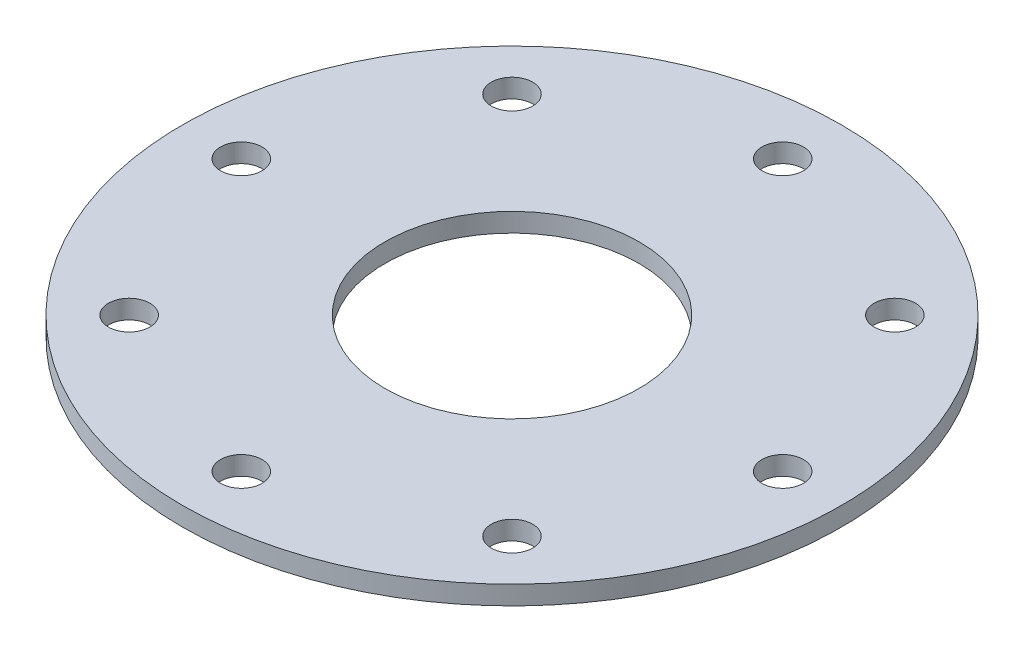
ISO-10303-21;
HEADER;
FILE_DESCRIPTION(('STEP AP214'),'2;1');
FILE_NAME('part.step','',(''),(''),'','','');
FILE_SCHEMA(('AUTOMOTIVE_DESIGN { 1 0 10303 214 1 1 1 1 }'));
ENDSEC;
DATA;
#1=APPLICATION_CONTEXT('core data for automotive mechanical design processes');
#2=APPLICATION_PROTOCOL_DEFINITION('international standard','automotive_design',2000,#1);
#3=PRODUCT_CONTEXT('',#1,'mechanical');
#4=PRODUCT('Part','Part','',(#3));
#5=PRODUCT_RELATED_PRODUCT_CATEGORY('part','',(#4));
#6=PRODUCT_DEFINITION_FORMATION('','',#4);
#7=PRODUCT_DEFINITION_CONTEXT('part definition',#1,'design');
#8=PRODUCT_DEFINITION('design','',#6,#7);
#9=PRODUCT_DEFINITION_SHAPE('','',#8);
#10=(LENGTH_UNIT() NAMED_UNIT(*) SI_UNIT(.MILLI.,.METRE.));
#11=(NAMED_UNIT(*) PLANE_ANGLE_UNIT() SI_UNIT($,.RADIAN.));
#12=(NAMED_UNIT(*) SI_UNIT($,.STERADIAN.) SOLID_ANGLE_UNIT());
#13=UNCERTAINTY_MEASURE_WITH_UNIT(LENGTH_MEASURE(1.E-05),#10,'distance_accuracy_value','');
#14=(GEOMETRIC_REPRESENTATION_CONTEXT(3) GLOBAL_UNCERTAINTY_ASSIGNED_CONTEXT((#13)) GLOBAL_UNIT_ASSIGNED_CONTEXT((#10,
#11,#12)) REPRESENTATION_CONTEXT('',''));
#15=CARTESIAN_POINT('',(0.,0.,0.));
#16=DIRECTION('',(0.,0.,1.));
#17=DIRECTION('',(1.,0.,0.));
#18=AXIS2_PLACEMENT_3D('',#15,#16,#17);
#19=CARTESIAN_POINT('',(0.,4.,0.));
#20=DIRECTION('',(0.,1.,0.));
#21=DIRECTION('',(0.,0.,1.));
#22=AXIS2_PLACEMENT_3D('',#19,#20,#21);
#23=PLANE('',#22);
#24=CARTESIAN_POINT('',(6.0228053095044E-13,4.,-57.5));
#25=DIRECTION('',(0.,1.,0.));
#26=DIRECTION('',(0.,0.,1.));
#27=AXIS2_PLACEMENT_3D('',#24,#25,#26);
#28=CIRCLE('',#27,4.4);
#29=CARTESIAN_POINT('',(6.0228053095044E-13,4.,-53.1));
#30=VERTEX_POINT('',#29);
#31=EDGE_CURVE('E93',#30,#30,#28,.T.);
#32=ORIENTED_EDGE('',*,*,#31,.F.);
#33=EDGE_LOOP('',(#32));
#34=FACE_BOUND('',#33,.T.);
#35=CARTESIAN_POINT('',(-57.5,4.,-4.1286418728248E-13));
#36=DIRECTION('',(0.,1.,0.));
#37=DIRECTION('',(0.,0.,1.));
#38=AXIS2_PLACEMENT_3D('',#35,#36,#37);
#39=CIRCLE('',#38,4.4);
#40=CARTESIAN_POINT('',(-57.5,4.,4.39999999999959));
#41=VERTEX_POINT('',#40);
#42=EDGE_CURVE('E79',#41,#41,#39,.T.);
#43=ORIENTED_EDGE('',*,*,#42,.F.);
#44=EDGE_LOOP('',(#43));
#45=FACE_BOUND('',#44,.T.);
#46=CARTESIAN_POINT('',(-1.03736463863413E-12,4.,57.5));
#47=DIRECTION('',(0.,1.,0.));
#48=DIRECTION('',(0.,0.,1.));
#49=AXIS2_PLACEMENT_3D('',#46,#47,#48);
#50=CIRCLE('',#49,4.4);
#51=CARTESIAN_POINT('',(-1.03736463863413E-12,4.,61.9));
#52=VERTEX_POINT('',#51);
#53=EDGE_CURVE('E70',#52,#52,#50,.T.);
#54=ORIENTED_EDGE('',*,*,#53,.F.);
#55=EDGE_LOOP('',(#54));
#56=FACE_BOUND('',#55,.T.);
#57=CARTESIAN_POINT('',(57.5,4.,0.));
#58=DIRECTION('',(0.,1.,0.));
#59=DIRECTION('',(0.,0.,1.));
#60=AXIS2_PLACEMENT_3D('',#57,#58,#59);
#61=CIRCLE('',#60,4.4);
#62=CARTESIAN_POINT('',(57.5,4.,4.4));
#63=VERTEX_POINT('',#62);
#64=EDGE_CURVE('E54',#63,#63,#61,.T.);
#65=ORIENTED_EDGE('',*,*,#64,.F.);
#66=EDGE_LOOP('',(#65));
#67=FACE_BOUND('',#66,.T.);
#68=CARTESIAN_POINT('',(0.,4.,0.));
#69=DIRECTION('',(0.,1.,0.));
#70=DIRECTION('',(0.,0.,1.));
#71=AXIS2_PLACEMENT_3D('',#68,#69,#70);
#72=CIRCLE('',#71,70.);
#73=CARTESIAN_POINT('',(0.,4.,70.));
#74=VERTEX_POINT('',#73);
#75=EDGE_CURVE('E10',#74,#74,#72,.T.);
#76=ORIENTED_EDGE('',*,*,#75,.T.);
#77=EDGE_LOOP('',(#76));
#78=FACE_BOUND('',#77,.T.);
#79=CARTESIAN_POINT('',(0.,4.,0.));
#80=DIRECTION('',(0.,1.,0.));
#81=DIRECTION('',(0.,0.,1.));
#82=AXIS2_PLACEMENT_3D('',#79,#80,#81);
#83=CIRCLE('',#82,27.);
#84=CARTESIAN_POINT('',(0.,4.,27.));
#85=VERTEX_POINT('',#84);
#86=EDGE_CURVE('E49',#85,#85,#83,.T.);
#87=ORIENTED_EDGE('',*,*,#86,.F.);
#88=EDGE_LOOP('',(#87));
#89=FACE_BOUND('',#88,.T.);
#90=CARTESIAN_POINT('',(40.6586399182258,4.,40.6586399182271));
#91=DIRECTION('',(0.,1.,0.));
#92=DIRECTION('',(0.,0.,1.));
#93=AXIS2_PLACEMENT_3D('',#90,#91,#92);
#94=CIRCLE('',#93,4.4);
#95=CARTESIAN_POINT('',(40.6586399182258,4.,45.0586399182271));
#96=VERTEX_POINT('',#95);
#97=EDGE_CURVE('E63',#96,#96,#94,.T.);
#98=ORIENTED_EDGE('',*,*,#97,.F.);
#99=EDGE_LOOP('',(#98));
#100=FACE_BOUND('',#99,.T.);
#101=CARTESIAN_POINT('',(-40.6586399182273,4.,40.6586399182257));
#102=DIRECTION('',(0.,1.,0.));
#103=DIRECTION('',(0.,0.,1.));
#104=AXIS2_PLACEMENT_3D('',#101,#102,#103);
#105=CIRCLE('',#104,4.4);
#106=CARTESIAN_POINT('',(-40.6586399182273,4.,45.0586399182257));
#107=VERTEX_POINT('',#106);
#108=EDGE_CURVE('E71',#107,#107,#105,.T.);
#109=ORIENTED_EDGE('',*,*,#108,.F.);
#110=EDGE_LOOP('',(#109));
#111=FACE_BOUND('',#110,.T.);
#112=CARTESIAN_POINT('',(-40.6586399182261,4.,-40.6586399182268));
#113=DIRECTION('',(0.,1.,0.));
#114=DIRECTION('',(0.,0.,1.));
#115=AXIS2_PLACEMENT_3D('',#112,#113,#114);
#116=CIRCLE('',#115,4.4);
#117=CARTESIAN_POINT('',(-40.6586399182261,4.,-36.2586399182268));
#118=VERTEX_POINT('',#117);
#119=EDGE_CURVE('E81',#118,#118,#116,.T.);
#120=ORIENTED_EDGE('',*,*,#119,.F.);
#121=EDGE_LOOP('',(#120));
#122=FACE_BOUND('',#121,.T.);
#123=CARTESIAN_POINT('',(40.658639918227,4.,-40.658639918226));
#124=DIRECTION('',(0.,1.,0.));
#125=DIRECTION('',(0.,0.,1.));
#126=AXIS2_PLACEMENT_3D('',#123,#124,#125);
#127=CIRCLE('',#126,4.4);
#128=CARTESIAN_POINT('',(40.658639918227,4.,-36.258639918226));
#129=VERTEX_POINT('',#128);
#130=EDGE_CURVE('E97',#129,#129,#127,.T.);
#131=ORIENTED_EDGE('',*,*,#130,.F.);
#132=EDGE_LOOP('',(#131));
#133=FACE_BOUND('',#132,.T.);
#134=ADVANCED_FACE('F39',(#34,#45,#56,#67,#78,#89,#100,#111,#122,#133),#23,.T.);
#135=CARTESIAN_POINT('',(0.,0.,0.));
#136=DIRECTION('',(0.,1.,0.));
#137=DIRECTION('',(0.,0.,1.));
#138=AXIS2_PLACEMENT_3D('',#135,#136,#137);
#139=PLANE('',#138);
#140=CARTESIAN_POINT('',(0.,0.,0.));
#141=DIRECTION('',(0.,1.,0.));
#142=DIRECTION('',(0.,0.,1.));
#143=AXIS2_PLACEMENT_3D('',#140,#141,#142);
#144=CIRCLE('',#143,70.);
#145=CARTESIAN_POINT('',(0.,0.,70.));
#146=VERTEX_POINT('',#145);
#147=EDGE_CURVE('E43',#146,#146,#144,.T.);
#148=ORIENTED_EDGE('',*,*,#147,.F.);
#149=EDGE_LOOP('',(#148));
#150=FACE_BOUND('',#149,.T.);
#151=CARTESIAN_POINT('',(0.,0.,0.));
#152=DIRECTION('',(0.,1.,0.));
#153=DIRECTION('',(0.,0.,1.));
#154=AXIS2_PLACEMENT_3D('',#151,#152,#153);
#155=CIRCLE('',#154,27.);
#156=CARTESIAN_POINT('',(0.,0.,27.));
#157=VERTEX_POINT('',#156);
#158=EDGE_CURVE('E55',#157,#157,#155,.T.);
#159=ORIENTED_EDGE('',*,*,#158,.T.);
#160=EDGE_LOOP('',(#159));
#161=FACE_BOUND('',#160,.T.);
#162=CARTESIAN_POINT('',(57.5,0.,0.));
#163=DIRECTION('',(0.,1.,0.));
#164=DIRECTION('',(0.,0.,1.));
#165=AXIS2_PLACEMENT_3D('',#162,#163,#164);
#166=CIRCLE('',#165,4.4);
#167=CARTESIAN_POINT('',(57.5,0.,4.4));
#168=VERTEX_POINT('',#167);
#169=EDGE_CURVE('E59',#168,#168,#166,.T.);
#170=ORIENTED_EDGE('',*,*,#169,.T.);
#171=EDGE_LOOP('',(#170));
#172=FACE_BOUND('',#171,.T.);
#173=CARTESIAN_POINT('',(40.6586399182258,0.,40.6586399182271));
#174=DIRECTION('',(0.,1.,0.));
#175=DIRECTION('',(0.,0.,1.));
#176=AXIS2_PLACEMENT_3D('',#173,#174,#175);
#177=CIRCLE('',#176,4.4);
#178=CARTESIAN_POINT('',(40.6586399182258,0.,45.0586399182271));
#179=VERTEX_POINT('',#178);
#180=EDGE_CURVE('E65',#179,#179,#177,.T.);
#181=ORIENTED_EDGE('',*,*,#180,.T.);
#182=EDGE_LOOP('',(#181));
#183=FACE_BOUND('',#182,.T.);
#184=CARTESIAN_POINT('',(-1.03736463863413E-12,0.,57.5));
#185=DIRECTION('',(0.,1.,0.));
#186=DIRECTION('',(0.,0.,1.));
#187=AXIS2_PLACEMENT_3D('',#184,#185,#186);
#188=CIRCLE('',#187,4.4);
#189=CARTESIAN_POINT('',(-1.03736463863413E-12,0.,61.9));
#190=VERTEX_POINT('',#189);
#191=EDGE_CURVE('E69',#190,#190,#188,.T.);
#192=ORIENTED_EDGE('',*,*,#191,.T.);
#193=EDGE_LOOP('',(#192));
#194=FACE_BOUND('',#193,.T.);
#195=CARTESIAN_POINT('',(-40.6586399182273,0.,40.6586399182257));
#196=DIRECTION('',(0.,1.,0.));
#197=DIRECTION('',(0.,0.,1.));
#198=AXIS2_PLACEMENT_3D('',#195,#196,#197);
#199=CIRCLE('',#198,4.4);
#200=CARTESIAN_POINT('',(-40.6586399182273,0.,45.0586399182257));
#201=VERTEX_POINT('',#200);
#202=EDGE_CURVE('E77',#201,#201,#199,.T.);
#203=ORIENTED_EDGE('',*,*,#202,.T.);
#204=EDGE_LOOP('',(#203));
#205=FACE_BOUND('',#204,.T.);
#206=CARTESIAN_POINT('',(-57.5,0.,-4.1286418728248E-13));
#207=DIRECTION('',(0.,1.,0.));
#208=DIRECTION('',(0.,0.,1.));
#209=AXIS2_PLACEMENT_3D('',#206,#207,#208);
#210=CIRCLE('',#209,4.4);
#211=CARTESIAN_POINT('',(-57.5,0.,4.39999999999959));
#212=VERTEX_POINT('',#211);
#213=EDGE_CURVE('E84',#212,#212,#210,.T.);
#214=ORIENTED_EDGE('',*,*,#213,.T.);
#215=EDGE_LOOP('',(#214));
#216=FACE_BOUND('',#215,.T.);
#217=CARTESIAN_POINT('',(-40.6586399182261,0.,-40.6586399182268));
#218=DIRECTION('',(0.,1.,0.));
#219=DIRECTION('',(0.,0.,1.));
#220=AXIS2_PLACEMENT_3D('',#217,#218,#219);
#221=CIRCLE('',#220,4.4);
#222=CARTESIAN_POINT('',(-40.6586399182261,0.,-36.2586399182268));
#223=VERTEX_POINT('',#222);
#224=EDGE_CURVE('E87',#223,#223,#221,.T.);
#225=ORIENTED_EDGE('',*,*,#224,.T.);
#226=EDGE_LOOP('',(#225));
#227=FACE_BOUND('',#226,.T.);
#228=CARTESIAN_POINT('',(6.0228053095044E-13,0.,-57.5));
#229=DIRECTION('',(0.,1.,0.));
#230=DIRECTION('',(0.,0.,1.));
#231=AXIS2_PLACEMENT_3D('',#228,#229,#230);
#232=CIRCLE('',#231,4.4);
#233=CARTESIAN_POINT('',(6.0228053095044E-13,0.,-53.1));
#234=VERTEX_POINT('',#233);
#235=EDGE_CURVE('E94',#234,#234,#232,.T.);
#236=ORIENTED_EDGE('',*,*,#235,.T.);
#237=EDGE_LOOP('',(#236));
#238=FACE_BOUND('',#237,.T.);
#239=CARTESIAN_POINT('',(40.658639918227,0.,-40.658639918226));
#240=DIRECTION('',(0.,1.,0.));
#241=DIRECTION('',(0.,0.,1.));
#242=AXIS2_PLACEMENT_3D('',#239,#240,#241);
#243=CIRCLE('',#242,4.4);
#244=CARTESIAN_POINT('',(40.658639918227,0.,-36.258639918226));
#245=VERTEX_POINT('',#244);
#246=EDGE_CURVE('E99',#245,#245,#243,.T.);
#247=ORIENTED_EDGE('',*,*,#246,.T.);
#248=EDGE_LOOP('',(#247));
#249=FACE_BOUND('',#248,.T.);
#250=ADVANCED_FACE('F109',(#150,#161,#172,#183,#194,#205,#216,#227,#238,#249),#139,.F.);
#251=CARTESIAN_POINT('',(0.,4.,0.));
#252=DIRECTION('',(0.,-1.,0.));
#253=DIRECTION('',(0.,0.,-1.));
#254=AXIS2_PLACEMENT_3D('',#251,#252,#253);
#255=CYLINDRICAL_SURFACE('',#254,70.);
#256=ORIENTED_EDGE('',*,*,#75,.F.);
#257=EDGE_LOOP('',(#256));
#258=FACE_BOUND('',#257,.T.);
#259=ORIENTED_EDGE('',*,*,#147,.T.);
#260=EDGE_LOOP('',(#259));
#261=FACE_BOUND('',#260,.T.);
#262=ADVANCED_FACE('F41',(#258,#261),#255,.T.);
#263=CARTESIAN_POINT('',(0.,4.,0.));
#264=DIRECTION('',(0.,-1.,0.));
#265=DIRECTION('',(0.,0.,-1.));
#266=AXIS2_PLACEMENT_3D('',#263,#264,#265);
#267=CYLINDRICAL_SURFACE('',#266,27.);
#268=ORIENTED_EDGE('',*,*,#86,.T.);
#269=EDGE_LOOP('',(#268));
#270=FACE_BOUND('',#269,.T.);
#271=ORIENTED_EDGE('',*,*,#158,.F.);
#272=EDGE_LOOP('',(#271));
#273=FACE_BOUND('',#272,.T.);
#274=ADVANCED_FACE('F119',(#270,#273),#267,.F.);
#275=CARTESIAN_POINT('',(57.5,4.,0.));
#276=DIRECTION('',(0.,-1.,0.));
#277=DIRECTION('',(0.,0.,-1.));
#278=AXIS2_PLACEMENT_3D('',#275,#276,#277);
#279=CYLINDRICAL_SURFACE('',#278,4.4);
#280=ORIENTED_EDGE('',*,*,#64,.T.);
#281=EDGE_LOOP('',(#280));
#282=FACE_BOUND('',#281,.T.);
#283=ORIENTED_EDGE('',*,*,#169,.F.);
#284=EDGE_LOOP('',(#283));
#285=FACE_BOUND('',#284,.T.);
#286=ADVANCED_FACE('F124',(#282,#285),#279,.F.);
#287=CARTESIAN_POINT('',(40.6586399182258,4.,40.6586399182271));
#288=DIRECTION('',(0.,-1.,0.));
#289=DIRECTION('',(0.,0.,-1.));
#290=AXIS2_PLACEMENT_3D('',#287,#288,#289);
#291=CYLINDRICAL_SURFACE('',#290,4.4);
#292=ORIENTED_EDGE('',*,*,#97,.T.);
#293=EDGE_LOOP('',(#292));
#294=FACE_BOUND('',#293,.T.);
#295=ORIENTED_EDGE('',*,*,#180,.F.);
#296=EDGE_LOOP('',(#295));
#297=FACE_BOUND('',#296,.T.);
#298=ADVANCED_FACE('F129',(#294,#297),#291,.F.);
#299=CARTESIAN_POINT('',(-1.03736463863413E-12,4.,57.5));
#300=DIRECTION('',(0.,-1.,0.));
#301=DIRECTION('',(0.,0.,-1.));
#302=AXIS2_PLACEMENT_3D('',#299,#300,#301);
#303=CYLINDRICAL_SURFACE('',#302,4.4);
#304=ORIENTED_EDGE('',*,*,#53,.T.);
#305=EDGE_LOOP('',(#304));
#306=FACE_BOUND('',#305,.T.);
#307=ORIENTED_EDGE('',*,*,#191,.F.);
#308=EDGE_LOOP('',(#307));
#309=FACE_BOUND('',#308,.T.);
#310=ADVANCED_FACE('F131',(#306,#309),#303,.F.);
#311=CARTESIAN_POINT('',(-40.6586399182273,4.,40.6586399182257));
#312=DIRECTION('',(0.,-1.,0.));
#313=DIRECTION('',(0.,0.,-1.));
#314=AXIS2_PLACEMENT_3D('',#311,#312,#313);
#315=CYLINDRICAL_SURFACE('',#314,4.4);
#316=ORIENTED_EDGE('',*,*,#108,.T.);
#317=EDGE_LOOP('',(#316));
#318=FACE_BOUND('',#317,.T.);
#319=ORIENTED_EDGE('',*,*,#202,.F.);
#320=EDGE_LOOP('',(#319));
#321=FACE_BOUND('',#320,.T.);
#322=ADVANCED_FACE('F134',(#318,#321),#315,.F.);
#323=CARTESIAN_POINT('',(-57.5,4.,-4.1286418728248E-13));
#324=DIRECTION('',(0.,-1.,0.));
#325=DIRECTION('',(0.,0.,-1.));
#326=AXIS2_PLACEMENT_3D('',#323,#324,#325);
#327=CYLINDRICAL_SURFACE('',#326,4.4);
#328=ORIENTED_EDGE('',*,*,#42,.T.);
#329=EDGE_LOOP('',(#328));
#330=FACE_BOUND('',#329,.T.);
#331=ORIENTED_EDGE('',*,*,#213,.F.);
#332=EDGE_LOOP('',(#331));
#333=FACE_BOUND('',#332,.T.);
#334=ADVANCED_FACE('F139',(#330,#333),#327,.F.);
#335=CARTESIAN_POINT('',(-40.6586399182261,4.,-40.6586399182268));
#336=DIRECTION('',(0.,-1.,0.));
#337=DIRECTION('',(0.,0.,-1.));
#338=AXIS2_PLACEMENT_3D('',#335,#336,#337);
#339=CYLINDRICAL_SURFACE('',#338,4.4);
#340=ORIENTED_EDGE('',*,*,#119,.T.);
#341=EDGE_LOOP('',(#340));
#342=FACE_BOUND('',#341,.T.);
#343=ORIENTED_EDGE('',*,*,#224,.F.);
#344=EDGE_LOOP('',(#343));
#345=FACE_BOUND('',#344,.T.);
#346=ADVANCED_FACE('F141',(#342,#345),#339,.F.);
#347=CARTESIAN_POINT('',(6.0228053095044E-13,4.,-57.5));
#348=DIRECTION('',(0.,-1.,0.));
#349=DIRECTION('',(0.,0.,-1.));
#350=AXIS2_PLACEMENT_3D('',#347,#348,#349);
#351=CYLINDRICAL_SURFACE('',#350,4.4);
#352=ORIENTED_EDGE('',*,*,#31,.T.);
#353=EDGE_LOOP('',(#352));
#354=FACE_BOUND('',#353,.T.);
#355=ORIENTED_EDGE('',*,*,#235,.F.);
#356=EDGE_LOOP('',(#355));
#357=FACE_BOUND('',#356,.T.);
#358=ADVANCED_FACE('F149',(#354,#357),#351,.F.);
#359=CARTESIAN_POINT('',(40.658639918227,4.,-40.658639918226));
#360=DIRECTION('',(0.,-1.,0.));
#361=DIRECTION('',(0.,0.,-1.));
#362=AXIS2_PLACEMENT_3D('',#359,#360,#361);
#363=CYLINDRICAL_SURFACE('',#362,4.4);
#364=ORIENTED_EDGE('',*,*,#130,.T.);
#365=EDGE_LOOP('',(#364));
#366=FACE_BOUND('',#365,.T.);
#367=ORIENTED_EDGE('',*,*,#246,.F.);
#368=EDGE_LOOP('',(#367));
#369=FACE_BOUND('',#368,.T.);
#370=ADVANCED_FACE('F106',(#366,#369),#363,.F.);
#371=CLOSED_SHELL('',(#134,#250,#262,#274,#286,#298,#310,#322,#334,#346,#358,#370));
#372=MANIFOLD_SOLID_BREP('B2',#371);
#373=ADVANCED_BREP_SHAPE_REPRESENTATION('',(#18,#372),#14);
#374=SHAPE_DEFINITION_REPRESENTATION(#9,#373);
ENDSEC;
END-ISO-10303-21;
